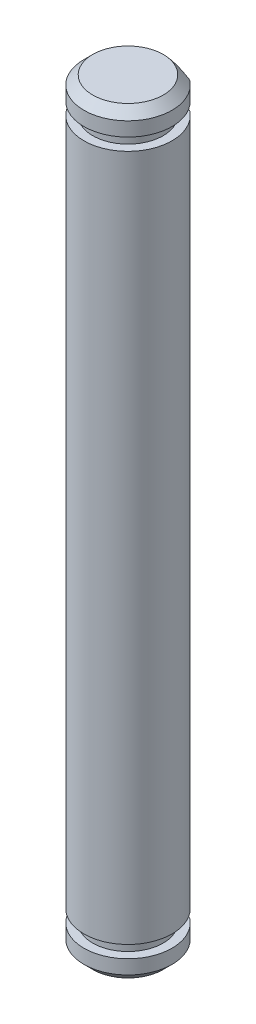
ISO-10303-21;
HEADER;
FILE_DESCRIPTION(('STEP AP214'),'2;1');
FILE_NAME('part.step','',(''),(''),'','','');
FILE_SCHEMA(('AUTOMOTIVE_DESIGN { 1 0 10303 214 1 1 1 1 }'));
ENDSEC;
DATA;
#1=APPLICATION_CONTEXT('core data for automotive mechanical design processes');
#2=APPLICATION_PROTOCOL_DEFINITION('international standard','automotive_design',2000,#1);
#3=PRODUCT_CONTEXT('',#1,'mechanical');
#4=PRODUCT('Part','Part','',(#3));
#5=PRODUCT_RELATED_PRODUCT_CATEGORY('part','',(#4));
#6=PRODUCT_DEFINITION_FORMATION('','',#4);
#7=PRODUCT_DEFINITION_CONTEXT('part definition',#1,'design');
#8=PRODUCT_DEFINITION('design','',#6,#7);
#9=PRODUCT_DEFINITION_SHAPE('','',#8);
#10=(LENGTH_UNIT() NAMED_UNIT(*) SI_UNIT(.MILLI.,.METRE.));
#11=(NAMED_UNIT(*) PLANE_ANGLE_UNIT() SI_UNIT($,.RADIAN.));
#12=(NAMED_UNIT(*) SI_UNIT($,.STERADIAN.) SOLID_ANGLE_UNIT());
#13=UNCERTAINTY_MEASURE_WITH_UNIT(LENGTH_MEASURE(1.E-05),#10,'distance_accuracy_value','');
#14=(GEOMETRIC_REPRESENTATION_CONTEXT(3) GLOBAL_UNCERTAINTY_ASSIGNED_CONTEXT((#13)) GLOBAL_UNIT_ASSIGNED_CONTEXT((#10,
#11,#12)) REPRESENTATION_CONTEXT('',''));
#15=CARTESIAN_POINT('',(0.,0.,0.));
#16=DIRECTION('',(0.,0.,1.));
#17=DIRECTION('',(1.,0.,0.));
#18=AXIS2_PLACEMENT_3D('',#15,#16,#17);
#19=CARTESIAN_POINT('',(-51.9890207107778,43.,23.1453724917969));
#20=DIRECTION('',(0.,-1.,0.));
#21=DIRECTION('',(0.,0.,-1.));
#22=AXIS2_PLACEMENT_3D('',#19,#20,#21);
#23=CYLINDRICAL_SURFACE('',#22,2.5);
#24=DIRECTION('',(0.,-1.,0.));
#25=VECTOR('',#24,1.);
#26=CARTESIAN_POINT('',(-53.4890207107778,43.,21.1453724917969));
#27=LINE('',#26,#25);
#28=CARTESIAN_POINT('',(-53.4890207107778,42.5,21.1453724917969));
#29=VERTEX_POINT('',#28);
#30=CARTESIAN_POINT('',(-53.4890207107778,41.7,21.1453724917969));
#31=VERTEX_POINT('',#30);
#32=EDGE_CURVE('E140',#29,#31,#27,.T.);
#33=ORIENTED_EDGE('',*,*,#32,.T.);
#34=CARTESIAN_POINT('',(-51.9890207107778,41.7,23.1453724917969));
#35=DIRECTION('',(0.,1.,0.));
#36=DIRECTION('',(0.,0.,1.));
#37=AXIS2_PLACEMENT_3D('',#34,#35,#36);
#38=CIRCLE('',#37,2.5);
#39=CARTESIAN_POINT('',(-50.4890207107778,41.7,21.1453724917969));
#40=VERTEX_POINT('',#39);
#41=EDGE_CURVE('E131',#31,#40,#38,.T.);
#42=ORIENTED_EDGE('',*,*,#41,.T.);
#43=DIRECTION('',(0.,-1.,0.));
#44=VECTOR('',#43,1.);
#45=CARTESIAN_POINT('',(-50.4890207107778,43.,21.1453724917969));
#46=LINE('',#45,#44);
#47=CARTESIAN_POINT('',(-50.4890207107778,42.5,21.1453724917969));
#48=VERTEX_POINT('',#47);
#49=EDGE_CURVE('E134',#40,#48,#46,.F.);
#50=ORIENTED_EDGE('',*,*,#49,.T.);
#51=CARTESIAN_POINT('',(-51.9890207107778,42.5,23.1453724917969));
#52=DIRECTION('',(0.,1.,0.));
#53=DIRECTION('',(0.,0.,1.));
#54=AXIS2_PLACEMENT_3D('',#51,#52,#53);
#55=CIRCLE('',#54,2.5);
#56=EDGE_CURVE('E235',#48,#29,#55,.F.);
#57=ORIENTED_EDGE('',*,*,#56,.T.);
#58=EDGE_LOOP('',(#33,#42,#50,#57));
#59=FACE_BOUND('',#58,.T.);
#60=ADVANCED_FACE('F35',(#59),#23,.T.);
#61=CARTESIAN_POINT('',(-50.4843442797553,0.,21.1453724917969));
#62=DIRECTION('',(0.,0.,1.));
#63=DIRECTION('',(1.,0.,0.));
#64=AXIS2_PLACEMENT_3D('',#61,#62,#63);
#65=PLANE('',#64);
#66=ORIENTED_EDGE('',*,*,#49,.F.);
#67=DIRECTION('',(-1.,0.,0.));
#68=VECTOR('',#67,1.);
#69=CARTESIAN_POINT('',(-50.4843442797553,41.7,21.1453724917969));
#70=LINE('',#69,#68);
#71=CARTESIAN_POINT('',(-51.9890207107778,41.7,21.1453724917969));
#72=VERTEX_POINT('',#71);
#73=EDGE_CURVE('E248',#40,#72,#70,.T.);
#74=ORIENTED_EDGE('',*,*,#73,.T.);
#75=EDGE_CURVE('E246',#72,#31,#70,.T.);
#76=ORIENTED_EDGE('',*,*,#75,.T.);
#77=ORIENTED_EDGE('',*,*,#32,.F.);
#78=CARTESIAN_POINT('',(-53.4890207107778,42.5,21.1453724917969));
#79=CARTESIAN_POINT('',(-53.41665089737,42.5433736980276,21.1453724917969));
#80=CARTESIAN_POINT('',(-53.3433829761004,42.5853687019536,21.1453724917969));
#81=CARTESIAN_POINT('',(-53.1945173170659,42.6656443583189,21.1453724917969));
#82=CARTESIAN_POINT('',(-53.1189122878849,42.7039114197061,21.1453724917969));
#83=CARTESIAN_POINT('',(-52.9673174456527,42.774534191742,21.1453724917969));
#84=CARTESIAN_POINT('',(-52.8913874470442,42.8070165390548,21.1453724917969));
#85=CARTESIAN_POINT('',(-52.7372413556819,42.8658090166989,21.1453724917969));
#86=CARTESIAN_POINT('',(-52.6590285868255,42.8921276624893,21.1453724917969));
#87=CARTESIAN_POINT('',(-52.5320813107971,42.9280861032667,21.1453724917969));
#88=CARTESIAN_POINT('',(-52.4840418742815,42.9401901027996,21.1453724917969));
#89=CARTESIAN_POINT('',(-52.3872811299954,42.9612794306282,21.1453724917969));
#90=CARTESIAN_POINT('',(-52.3385599089177,42.9702651517484,21.1453724917969));
#91=CARTESIAN_POINT('',(-52.2398728881798,42.984927124024,21.1453724917969));
#92=CARTESIAN_POINT('',(-52.1898993648165,42.9905520018212,21.1453724917969));
#93=CARTESIAN_POINT('',(-52.089628330054,42.9981023484678,21.1453724917969));
#94=CARTESIAN_POINT('',(-52.0393305580483,43.0000243314446,21.1453724917969));
#95=CARTESIAN_POINT('',(-51.9890207107778,43.,21.1453724917969));
#96=B_SPLINE_CURVE_WITH_KNOTS('',3,(#78,#79,#80,#81,#82,#83,#84,#85,#86,#87,#88,#89,#90,#91,#92,
#93,#94,#95),.UNSPECIFIED.,.F.,.F.,(4,2,2,2,2,2,2,2,4),(0.,0.253195034695594,0.50728107597429,
0.754837752612877,1.00205037282501,1.15058504578389,1.29910100031798,1.44983263801687,
1.60070610394701),.UNSPECIFIED.);
#97=CARTESIAN_POINT('',(-51.9890207107778,43.,21.1453724917969));
#98=VERTEX_POINT('',#97);
#99=EDGE_CURVE('E176',#29,#98,#96,.T.);
#100=ORIENTED_EDGE('',*,*,#99,.T.);
#101=CARTESIAN_POINT('',(-51.9890207107778,43.,21.1453724917969));
#102=CARTESIAN_POINT('',(-51.9275240626743,43.0000514930087,21.1453724917969));
#103=CARTESIAN_POINT('',(-51.866058914659,42.997164788165,21.1453724917969));
#104=CARTESIAN_POINT('',(-51.7437460407208,42.9859212389057,21.1453724917969));
#105=CARTESIAN_POINT('',(-51.6828973480023,42.9775750221521,21.1453724917969));
#106=CARTESIAN_POINT('',(-51.5631352008709,42.9559969816614,21.1453724917969));
#107=CARTESIAN_POINT('',(-51.5042063935055,42.9428488248966,21.1453724917969));
#108=CARTESIAN_POINT('',(-51.3874651847033,42.9122507618696,21.1453724917969));
#109=CARTESIAN_POINT('',(-51.3296532543671,42.8947990813251,21.1453724917969));
#110=CARTESIAN_POINT('',(-51.2044444473445,42.8525702057821,21.1453724917969));
#111=CARTESIAN_POINT('',(-51.1373062000172,42.8270315815753,21.1453724917969));
#112=CARTESIAN_POINT('',(-51.0047706862009,42.7717452055524,21.1453724917969));
#113=CARTESIAN_POINT('',(-50.9393742857099,42.7419954048129,21.1453724917969));
#114=CARTESIAN_POINT('',(-50.8088552453558,42.6784785026746,21.1453724917969));
#115=CARTESIAN_POINT('',(-50.7437679953256,42.6446394298057,21.1453724917969));
#116=CARTESIAN_POINT('',(-50.6152387407166,42.5742160914667,21.1453724917969));
#117=CARTESIAN_POINT('',(-50.5517940490348,42.5376367483736,21.1453724917969));
#118=CARTESIAN_POINT('',(-50.4890207107778,42.5,21.1453724917969));
#119=B_SPLINE_CURVE_WITH_KNOTS('',3,(#101,#102,#103,#104,#105,#106,#107,#108,#109,#110,#111,
#112,#113,#114,#115,#116,#117,#118),.UNSPECIFIED.,.F.,.F.,(4,2,2,2,2,2,2,2,4),(0.,
0.184371949240818,0.368386057907032,0.54933605166429,0.73036077365488,0.945674044871399,
1.16109243790835,1.38109142427278,1.60070428639642),.UNSPECIFIED.);
#120=EDGE_CURVE('E181',#98,#48,#119,.T.);
#121=ORIENTED_EDGE('',*,*,#120,.T.);
#122=EDGE_LOOP('',(#66,#74,#76,#77,#100,#121));
#123=FACE_BOUND('',#122,.T.);
#124=ADVANCED_FACE('F167',(#123),#65,.F.);
#125=CARTESIAN_POINT('',(-51.9890207107778,43.,23.1453724917969));
#126=DIRECTION('',(0.,1.,0.));
#127=DIRECTION('',(0.,0.,1.));
#128=AXIS2_PLACEMENT_3D('',#125,#126,#127);
#129=PLANE('',#128);
#130=CARTESIAN_POINT('',(-51.9890207107778,43.,23.1453724917969));
#131=DIRECTION('',(0.,1.,0.));
#132=DIRECTION('',(0.,0.,1.));
#133=AXIS2_PLACEMENT_3D('',#130,#131,#132);
#134=CIRCLE('',#133,1.99999999999999);
#135=EDGE_CURVE('E143',#98,#98,#134,.T.);
#136=ORIENTED_EDGE('',*,*,#135,.T.);
#137=EDGE_LOOP('',(#136));
#138=FACE_BOUND('',#137,.T.);
#139=ADVANCED_FACE('F170',(#138),#129,.T.);
#140=CARTESIAN_POINT('',(-51.9890207107778,43.,23.1453724917969));
#141=DIRECTION('',(0.,-1.,0.));
#142=DIRECTION('',(0.,0.,-1.));
#143=AXIS2_PLACEMENT_3D('',#140,#141,#142);
#144=CONICAL_SURFACE('',#143,1.99999999999999,0.785398163397442);
#145=ORIENTED_EDGE('',*,*,#99,.F.);
#146=ORIENTED_EDGE('',*,*,#56,.F.);
#147=ORIENTED_EDGE('',*,*,#120,.F.);
#148=ORIENTED_EDGE('',*,*,#135,.F.);
#149=EDGE_LOOP('',(#145,#146,#147,#148));
#150=FACE_BOUND('',#149,.T.);
#151=ADVANCED_FACE('F186',(#150),#144,.T.);
#152=CARTESIAN_POINT('',(-54.7764539563662,41.7,23.1453724917969));
#153=DIRECTION('',(0.,1.,0.));
#154=DIRECTION('',(0.,0.,1.));
#155=AXIS2_PLACEMENT_3D('',#152,#153,#154);
#156=PLANE('',#155);
#157=ORIENTED_EDGE('',*,*,#75,.F.);
#158=CARTESIAN_POINT('',(-51.9890207107778,41.7,23.1453724917969));
#159=DIRECTION('',(0.,1.,0.));
#160=DIRECTION('',(0.,0.,1.));
#161=AXIS2_PLACEMENT_3D('',#158,#159,#160);
#162=CIRCLE('',#161,2.);
#163=EDGE_CURVE('E125',#72,#72,#162,.T.);
#164=ORIENTED_EDGE('',*,*,#163,.T.);
#165=ORIENTED_EDGE('',*,*,#73,.F.);
#166=ORIENTED_EDGE('',*,*,#41,.F.);
#167=EDGE_LOOP('',(#157,#164,#165,#166));
#168=FACE_BOUND('',#167,.T.);
#169=ADVANCED_FACE('F168',(#168),#156,.F.);
#170=CARTESIAN_POINT('',(-53.9890207107778,41.,23.1453724917969));
#171=DIRECTION('',(0.,-1.,0.));
#172=DIRECTION('',(0.,0.,-1.));
#173=AXIS2_PLACEMENT_3D('',#170,#171,#172);
#174=PLANE('',#173);
#175=DIRECTION('',(1.,0.,0.));
#176=VECTOR('',#175,1.);
#177=CARTESIAN_POINT('',(-50.4843442797553,41.,21.1453724917969));
#178=LINE('',#177,#176);
#179=CARTESIAN_POINT('',(-51.9890207107778,41.,21.1453724917969));
#180=VERTEX_POINT('',#179);
#181=CARTESIAN_POINT('',(-50.4890207107778,41.,21.1453724917969));
#182=VERTEX_POINT('',#181);
#183=EDGE_CURVE('E230',#180,#182,#178,.T.);
#184=ORIENTED_EDGE('',*,*,#183,.F.);
#185=CARTESIAN_POINT('',(-51.9890207107778,41.,23.1453724917969));
#186=DIRECTION('',(0.,1.,0.));
#187=DIRECTION('',(0.,0.,1.));
#188=AXIS2_PLACEMENT_3D('',#185,#186,#187);
#189=CIRCLE('',#188,2.);
#190=EDGE_CURVE('E122',#180,#180,#189,.T.);
#191=ORIENTED_EDGE('',*,*,#190,.F.);
#192=CARTESIAN_POINT('',(-53.4890207107778,41.,21.1453724917969));
#193=VERTEX_POINT('',#192);
#194=EDGE_CURVE('E245',#193,#180,#178,.T.);
#195=ORIENTED_EDGE('',*,*,#194,.F.);
#196=CARTESIAN_POINT('',(-51.9890207107778,41.,23.1453724917969));
#197=DIRECTION('',(0.,-1.,0.));
#198=DIRECTION('',(0.,0.,-1.));
#199=AXIS2_PLACEMENT_3D('',#196,#197,#198);
#200=CIRCLE('',#199,2.5);
#201=EDGE_CURVE('E128',#182,#193,#200,.T.);
#202=ORIENTED_EDGE('',*,*,#201,.F.);
#203=EDGE_LOOP('',(#184,#191,#195,#202));
#204=FACE_BOUND('',#203,.T.);
#205=ADVANCED_FACE('F253',(#204),#174,.F.);
#206=CARTESIAN_POINT('',(-51.9890207107778,43.,23.1453724917969));
#207=DIRECTION('',(0.,1.,0.));
#208=DIRECTION('',(0.,0.,1.));
#209=AXIS2_PLACEMENT_3D('',#206,#207,#208);
#210=CYLINDRICAL_SURFACE('',#209,2.);
#211=ORIENTED_EDGE('',*,*,#190,.T.);
#212=EDGE_LOOP('',(#211));
#213=FACE_BOUND('',#212,.T.);
#214=ORIENTED_EDGE('',*,*,#163,.F.);
#215=EDGE_LOOP('',(#214));
#216=FACE_BOUND('',#215,.T.);
#217=ADVANCED_FACE('F165',(#213,#216),#210,.T.);
#218=CARTESIAN_POINT('',(-50.4890207107778,2.,21.1453724917969));
#219=VERTEX_POINT('',#218);
#220=EDGE_CURVE('E139',#219,#182,#46,.F.);
#221=ORIENTED_EDGE('',*,*,#220,.F.);
#222=DIRECTION('',(-1.,0.,0.));
#223=VECTOR('',#222,1.);
#224=CARTESIAN_POINT('',(-50.4843442797553,2.,21.1453724917969));
#225=LINE('',#224,#223);
#226=CARTESIAN_POINT('',(-51.9890207107778,2.,21.1453724917969));
#227=VERTEX_POINT('',#226);
#228=EDGE_CURVE('E58',#219,#227,#225,.T.);
#229=ORIENTED_EDGE('',*,*,#228,.T.);
#230=CARTESIAN_POINT('',(-53.4890207107778,2.,21.1453724917969));
#231=VERTEX_POINT('',#230);
#232=EDGE_CURVE('E106',#227,#231,#225,.T.);
#233=ORIENTED_EDGE('',*,*,#232,.T.);
#234=EDGE_CURVE('E144',#193,#231,#27,.T.);
#235=ORIENTED_EDGE('',*,*,#234,.F.);
#236=ORIENTED_EDGE('',*,*,#194,.T.);
#237=ORIENTED_EDGE('',*,*,#183,.T.);
#238=EDGE_LOOP('',(#221,#229,#233,#235,#236,#237));
#239=FACE_BOUND('',#238,.T.);
#240=ADVANCED_FACE('F159',(#239),#65,.F.);
#241=ORIENTED_EDGE('',*,*,#234,.T.);
#242=CARTESIAN_POINT('',(-51.9890207107778,2.,23.1453724917969));
#243=DIRECTION('',(0.,1.,0.));
#244=DIRECTION('',(0.,0.,1.));
#245=AXIS2_PLACEMENT_3D('',#242,#243,#244);
#246=CIRCLE('',#245,2.5);
#247=EDGE_CURVE('E44',#231,#219,#246,.T.);
#248=ORIENTED_EDGE('',*,*,#247,.T.);
#249=ORIENTED_EDGE('',*,*,#220,.T.);
#250=ORIENTED_EDGE('',*,*,#201,.T.);
#251=EDGE_LOOP('',(#241,#248,#249,#250));
#252=FACE_BOUND('',#251,.T.);
#253=ADVANCED_FACE('F164',(#252),#23,.T.);
#254=CARTESIAN_POINT('',(-54.7764539563662,1.3,23.1453724917969));
#255=DIRECTION('',(0.,-1.,0.));
#256=DIRECTION('',(0.,0.,-1.));
#257=AXIS2_PLACEMENT_3D('',#254,#255,#256);
#258=PLANE('',#257);
#259=CARTESIAN_POINT('',(-51.9890207107778,1.3,23.1453724917969));
#260=DIRECTION('',(0.,-1.,0.));
#261=DIRECTION('',(0.,0.,-1.));
#262=AXIS2_PLACEMENT_3D('',#259,#260,#261);
#263=CIRCLE('',#262,2.5);
#264=CARTESIAN_POINT('',(-50.4890207107778,1.3,21.1453724917969));
#265=VERTEX_POINT('',#264);
#266=CARTESIAN_POINT('',(-53.4890207107778,1.3,21.1453724917969));
#267=VERTEX_POINT('',#266);
#268=EDGE_CURVE('E11',#265,#267,#263,.T.);
#269=ORIENTED_EDGE('',*,*,#268,.F.);
#270=DIRECTION('',(1.,0.,0.));
#271=VECTOR('',#270,1.);
#272=CARTESIAN_POINT('',(-50.4843442797553,1.3,21.1453724917969));
#273=LINE('',#272,#271);
#274=CARTESIAN_POINT('',(-51.9890207107778,1.3,21.1453724917969));
#275=VERTEX_POINT('',#274);
#276=EDGE_CURVE('E115',#275,#265,#273,.T.);
#277=ORIENTED_EDGE('',*,*,#276,.F.);
#278=CARTESIAN_POINT('',(-51.9890207107778,1.3,23.1453724917969));
#279=DIRECTION('',(0.,1.,0.));
#280=DIRECTION('',(0.,0.,1.));
#281=AXIS2_PLACEMENT_3D('',#278,#279,#280);
#282=CIRCLE('',#281,2.);
#283=EDGE_CURVE('E113',#275,#275,#282,.T.);
#284=ORIENTED_EDGE('',*,*,#283,.F.);
#285=EDGE_CURVE('E51',#267,#275,#273,.T.);
#286=ORIENTED_EDGE('',*,*,#285,.F.);
#287=EDGE_LOOP('',(#269,#277,#284,#286));
#288=FACE_BOUND('',#287,.T.);
#289=ADVANCED_FACE('F193',(#288),#258,.F.);
#290=CARTESIAN_POINT('',(-53.9890207107778,2.,23.1453724917969));
#291=DIRECTION('',(0.,1.,0.));
#292=DIRECTION('',(0.,0.,1.));
#293=AXIS2_PLACEMENT_3D('',#290,#291,#292);
#294=PLANE('',#293);
#295=ORIENTED_EDGE('',*,*,#247,.F.);
#296=ORIENTED_EDGE('',*,*,#232,.F.);
#297=CARTESIAN_POINT('',(-51.9890207107778,2.,23.1453724917969));
#298=DIRECTION('',(0.,1.,0.));
#299=DIRECTION('',(0.,0.,1.));
#300=AXIS2_PLACEMENT_3D('',#297,#298,#299);
#301=CIRCLE('',#300,2.);
#302=EDGE_CURVE('E109',#227,#227,#301,.T.);
#303=ORIENTED_EDGE('',*,*,#302,.T.);
#304=ORIENTED_EDGE('',*,*,#228,.F.);
#305=EDGE_LOOP('',(#295,#296,#303,#304));
#306=FACE_BOUND('',#305,.T.);
#307=ADVANCED_FACE('F107',(#306),#294,.F.);
#308=CARTESIAN_POINT('',(-51.9890207107778,43.,23.1453724917969));
#309=DIRECTION('',(0.,1.,0.));
#310=DIRECTION('',(0.,0.,1.));
#311=AXIS2_PLACEMENT_3D('',#308,#309,#310);
#312=CYLINDRICAL_SURFACE('',#311,2.);
#313=ORIENTED_EDGE('',*,*,#283,.T.);
#314=EDGE_LOOP('',(#313));
#315=FACE_BOUND('',#314,.T.);
#316=ORIENTED_EDGE('',*,*,#302,.F.);
#317=EDGE_LOOP('',(#316));
#318=FACE_BOUND('',#317,.T.);
#319=ADVANCED_FACE('F198',(#315,#318),#312,.T.);
#320=CARTESIAN_POINT('',(-51.9890207107778,0.,23.1453724917969));
#321=DIRECTION('',(0.,1.,0.));
#322=DIRECTION('',(0.,0.,1.));
#323=AXIS2_PLACEMENT_3D('',#320,#321,#322);
#324=PLANE('',#323);
#325=CARTESIAN_POINT('',(-51.9890207107778,0.,23.1453724917969));
#326=DIRECTION('',(0.,1.,0.));
#327=DIRECTION('',(0.,0.,1.));
#328=AXIS2_PLACEMENT_3D('',#325,#326,#327);
#329=CIRCLE('',#328,1.99999999999999);
#330=CARTESIAN_POINT('',(-51.9890207107778,0.,21.1453724917969));
#331=VERTEX_POINT('',#330);
#332=EDGE_CURVE('E240',#331,#331,#329,.F.);
#333=ORIENTED_EDGE('',*,*,#332,.T.);
#334=EDGE_LOOP('',(#333));
#335=FACE_BOUND('',#334,.T.);
#336=ADVANCED_FACE('F196',(#335),#324,.F.);
#337=CARTESIAN_POINT('',(-51.9890207107778,0.5,23.1453724917969));
#338=DIRECTION('',(0.,1.,0.));
#339=DIRECTION('',(0.,0.,1.));
#340=AXIS2_PLACEMENT_3D('',#337,#338,#339);
#341=CONICAL_SURFACE('',#340,2.5,0.785398163397456);
#342=CARTESIAN_POINT('',(-51.9890207107778,0.,21.1453724917969));
#343=CARTESIAN_POINT('',(-52.0505173588814,-5.14930087551323E-05,21.1453724917969));
#344=CARTESIAN_POINT('',(-52.1119825068966,0.00283521183498165,21.1453724917969));
#345=CARTESIAN_POINT('',(-52.2342953808349,0.0140787610943231,21.1453724917969));
#346=CARTESIAN_POINT('',(-52.2951440735533,0.0224249778479222,21.1453724917969));
#347=CARTESIAN_POINT('',(-52.4149062206847,0.0440030183386315,21.1453724917969));
#348=CARTESIAN_POINT('',(-52.4738350280501,0.05715117510343,21.1453724917969));
#349=CARTESIAN_POINT('',(-52.5905762368524,0.0877492381304132,21.1453724917969));
#350=CARTESIAN_POINT('',(-52.6483881671886,0.105200918674915,21.1453724917969));
#351=CARTESIAN_POINT('',(-52.7735969742111,0.147429794217922,21.1453724917969));
#352=CARTESIAN_POINT('',(-52.8407352215385,0.172968418424725,21.1453724917969));
#353=CARTESIAN_POINT('',(-52.9732707353547,0.228254794447549,21.1453724917969));
#354=CARTESIAN_POINT('',(-53.0386671358458,0.258004595187106,21.1453724917969));
#355=CARTESIAN_POINT('',(-53.1691861761999,0.321521497325427,21.1453724917969));
#356=CARTESIAN_POINT('',(-53.23427342623,0.355360570194304,21.1453724917969));
#357=CARTESIAN_POINT('',(-53.362802680839,0.425783908533264,21.1453724917969));
#358=CARTESIAN_POINT('',(-53.4262473725208,0.462363251626413,21.1453724917969));
#359=CARTESIAN_POINT('',(-53.4890207107778,0.5,21.1453724917969));
#360=B_SPLINE_CURVE_WITH_KNOTS('',3,(#342,#343,#344,#345,#346,#347,#348,#349,#350,#351,#352,
#353,#354,#355,#356,#357,#358,#359),.UNSPECIFIED.,.F.,.F.,(4,2,2,2,2,2,2,2,4),(0.,
0.184371949240825,0.368386057907039,0.549336051664297,0.730360773654894,0.945674044871398,
1.16109243790836,1.38109142427279,1.60070428639642),.UNSPECIFIED.);
#361=CARTESIAN_POINT('',(-53.4890207107778,0.500000000000001,21.1453724917969));
#362=VERTEX_POINT('',#361);
#363=EDGE_CURVE('E147',#331,#362,#360,.T.);
#364=ORIENTED_EDGE('',*,*,#363,.F.);
#365=ORIENTED_EDGE('',*,*,#332,.F.);
#366=CARTESIAN_POINT('',(-50.4890207107778,0.500000000000001,21.1453724917969));
#367=CARTESIAN_POINT('',(-50.5613905241857,0.456626301972382,21.1453724917969));
#368=CARTESIAN_POINT('',(-50.6346584454552,0.414631298046413,21.1453724917969));
#369=CARTESIAN_POINT('',(-50.7835241044897,0.334355641681094,21.1453724917969));
#370=CARTESIAN_POINT('',(-50.8591291336708,0.296088580293858,21.1453724917969));
#371=CARTESIAN_POINT('',(-51.010723975903,0.225465808258029,21.1453724917969));
#372=CARTESIAN_POINT('',(-51.0866539745114,0.192983460945197,21.1453724917969));
#373=CARTESIAN_POINT('',(-51.2408000658738,0.134190983301057,21.1453724917969));
#374=CARTESIAN_POINT('',(-51.3190128347301,0.107872337510673,21.1453724917969));
#375=CARTESIAN_POINT('',(-51.4459601107586,0.0719138967333384,21.1453724917969));
#376=CARTESIAN_POINT('',(-51.4939995472742,0.0598098972004163,21.1453724917969));
#377=CARTESIAN_POINT('',(-51.5907602915603,0.0387205693718217,21.1453724917969));
#378=CARTESIAN_POINT('',(-51.639481512638,0.0297348482516347,21.1453724917969));
#379=CARTESIAN_POINT('',(-51.7381685333759,0.0150728759759629,21.1453724917969));
#380=CARTESIAN_POINT('',(-51.7881420567392,0.00944799817878216,21.1453724917969));
#381=CARTESIAN_POINT('',(-51.8884130915017,0.00189765153224522,21.1453724917969));
#382=CARTESIAN_POINT('',(-51.9387108635073,-2.43314446042288E-05,21.1453724917969));
#383=CARTESIAN_POINT('',(-51.9890207107778,0.,21.1453724917969));
#384=B_SPLINE_CURVE_WITH_KNOTS('',3,(#366,#367,#368,#369,#370,#371,#372,#373,#374,#375,#376,
#377,#378,#379,#380,#381,#382,#383),.UNSPECIFIED.,.F.,.F.,(4,2,2,2,2,2,2,2,4),(0.,
0.253195034695594,0.507281075974288,0.754837752612887,1.00205037282503,1.1505850457839,
1.29910100031798,1.44983263801687,1.600706103947),.UNSPECIFIED.);
#385=CARTESIAN_POINT('',(-50.4890207107778,0.500000000000001,21.1453724917969));
#386=VERTEX_POINT('',#385);
#387=EDGE_CURVE('E154',#386,#331,#384,.T.);
#388=ORIENTED_EDGE('',*,*,#387,.F.);
#389=CARTESIAN_POINT('',(-51.9890207107778,0.5,23.1453724917969));
#390=DIRECTION('',(0.,1.,0.));
#391=DIRECTION('',(0.,0.,1.));
#392=AXIS2_PLACEMENT_3D('',#389,#390,#391);
#393=CIRCLE('',#392,2.5);
#394=EDGE_CURVE('E223',#362,#386,#393,.T.);
#395=ORIENTED_EDGE('',*,*,#394,.F.);
#396=EDGE_LOOP('',(#364,#365,#388,#395));
#397=FACE_BOUND('',#396,.T.);
#398=ADVANCED_FACE('F37',(#397),#341,.T.);
#399=EDGE_CURVE('E135',#386,#265,#46,.F.);
#400=ORIENTED_EDGE('',*,*,#399,.T.);
#401=ORIENTED_EDGE('',*,*,#268,.T.);
#402=EDGE_CURVE('E138',#267,#362,#27,.T.);
#403=ORIENTED_EDGE('',*,*,#402,.T.);
#404=ORIENTED_EDGE('',*,*,#394,.T.);
#405=EDGE_LOOP('',(#400,#401,#403,#404));
#406=FACE_BOUND('',#405,.T.);
#407=ADVANCED_FACE('F195',(#406),#23,.T.);
#408=ORIENTED_EDGE('',*,*,#402,.F.);
#409=ORIENTED_EDGE('',*,*,#285,.T.);
#410=ORIENTED_EDGE('',*,*,#276,.T.);
#411=ORIENTED_EDGE('',*,*,#399,.F.);
#412=ORIENTED_EDGE('',*,*,#387,.T.);
#413=ORIENTED_EDGE('',*,*,#363,.T.);
#414=EDGE_LOOP('',(#408,#409,#410,#411,#412,#413));
#415=FACE_BOUND('',#414,.T.);
#416=ADVANCED_FACE('F166',(#415),#65,.F.);
#417=CLOSED_SHELL('',(#60,#124,#139,#151,#169,#205,#217,#240,#253,#289,#307,#319,#336,#398,#407,#416));
#418=MANIFOLD_SOLID_BREP('B2',#417);
#419=ADVANCED_BREP_SHAPE_REPRESENTATION('',(#18,#418),#14);
#420=SHAPE_DEFINITION_REPRESENTATION(#9,#419);
ENDSEC;
END-ISO-10303-21;
